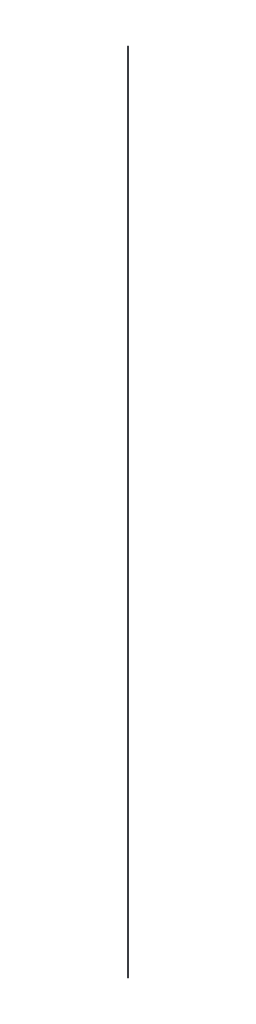
ISO-10303-21;
HEADER;
FILE_DESCRIPTION(('STEP AP214'),'2;1');
FILE_NAME('part.step','',(''),(''),'','','');
FILE_SCHEMA(('AUTOMOTIVE_DESIGN { 1 0 10303 214 1 1 1 1 }'));
ENDSEC;
DATA;
#1=APPLICATION_CONTEXT('core data for automotive mechanical design processes');
#2=APPLICATION_PROTOCOL_DEFINITION('international standard','automotive_design',2000,#1);
#3=PRODUCT_CONTEXT('',#1,'mechanical');
#4=PRODUCT('Part','Part','',(#3));
#5=PRODUCT_RELATED_PRODUCT_CATEGORY('part','',(#4));
#6=PRODUCT_DEFINITION_FORMATION('','',#4);
#7=PRODUCT_DEFINITION_CONTEXT('part definition',#1,'design');
#8=PRODUCT_DEFINITION('design','',#6,#7);
#9=PRODUCT_DEFINITION_SHAPE('','',#8);
#10=(LENGTH_UNIT() NAMED_UNIT(*) SI_UNIT(.MILLI.,.METRE.));
#11=(NAMED_UNIT(*) PLANE_ANGLE_UNIT() SI_UNIT($,.RADIAN.));
#12=(NAMED_UNIT(*) SI_UNIT($,.STERADIAN.) SOLID_ANGLE_UNIT());
#13=UNCERTAINTY_MEASURE_WITH_UNIT(LENGTH_MEASURE(1.E-05),#10,'distance_accuracy_value','');
#14=(GEOMETRIC_REPRESENTATION_CONTEXT(3) GLOBAL_UNCERTAINTY_ASSIGNED_CONTEXT((#13)) GLOBAL_UNIT_ASSIGNED_CONTEXT((#10,
#11,#12)) REPRESENTATION_CONTEXT('',''));
#15=CARTESIAN_POINT('',(0.,0.,0.));
#16=DIRECTION('',(0.,0.,1.));
#17=DIRECTION('',(1.,0.,0.));
#18=AXIS2_PLACEMENT_3D('',#15,#16,#17);
#19=CARTESIAN_POINT('',(0.,0.,0.));
#20=DIRECTION('',(0.,1.,0.));
#21=DIRECTION('',(0.,0.,1.));
#22=AXIS2_PLACEMENT_3D('',#19,#20,#21);
#23=PLANE('',#22);
#24=CARTESIAN_POINT('',(0.,0.,0.));
#25=DIRECTION('',(0.,1.,0.));
#26=DIRECTION('',(0.,0.,1.));
#27=AXIS2_PLACEMENT_3D('',#24,#25,#26);
#28=CIRCLE('',#27,0.25);
#29=CARTESIAN_POINT('',(0.,0.,0.25));
#30=VERTEX_POINT('',#29);
#31=EDGE_CURVE('E50',#30,#30,#28,.T.);
#32=ORIENTED_EDGE('',*,*,#31,.F.);
#33=EDGE_LOOP('',(#32));
#34=FACE_BOUND('',#33,.T.);
#35=ADVANCED_FACE('F43',(#34),#23,.F.);
#36=CARTESIAN_POINT('',(0.,765.2,0.));
#37=DIRECTION('',(0.,1.,0.));
#38=DIRECTION('',(0.,0.,1.));
#39=AXIS2_PLACEMENT_3D('',#36,#37,#38);
#40=PLANE('',#39);
#41=CARTESIAN_POINT('',(0.,765.2,0.));
#42=DIRECTION('',(0.,1.,0.));
#43=DIRECTION('',(0.,0.,1.));
#44=AXIS2_PLACEMENT_3D('',#41,#42,#43);
#45=CIRCLE('',#44,0.25);
#46=CARTESIAN_POINT('',(0.,765.2,0.25));
#47=VERTEX_POINT('',#46);
#48=EDGE_CURVE('E10',#47,#47,#45,.T.);
#49=ORIENTED_EDGE('',*,*,#48,.T.);
#50=EDGE_LOOP('',(#49));
#51=FACE_BOUND('',#50,.T.);
#52=ADVANCED_FACE('F60',(#51),#40,.T.);
#53=CARTESIAN_POINT('',(0.,0.,0.));
#54=DIRECTION('',(0.,1.,0.));
#55=DIRECTION('',(0.,0.,1.));
#56=AXIS2_PLACEMENT_3D('',#53,#54,#55);
#57=CYLINDRICAL_SURFACE('',#56,0.25);
#58=ORIENTED_EDGE('',*,*,#48,.F.);
#59=EDGE_LOOP('',(#58));
#60=FACE_BOUND('',#59,.T.);
#61=ORIENTED_EDGE('',*,*,#31,.T.);
#62=EDGE_LOOP('',(#61));
#63=FACE_BOUND('',#62,.T.);
#64=ADVANCED_FACE('F57',(#60,#63),#57,.T.);
#65=CLOSED_SHELL('',(#35,#52,#64));
#66=MANIFOLD_SOLID_BREP('B2',#65);
#67=ADVANCED_BREP_SHAPE_REPRESENTATION('',(#18,#66),#14);
#68=SHAPE_DEFINITION_REPRESENTATION(#9,#67);
ENDSEC;
END-ISO-10303-21;
